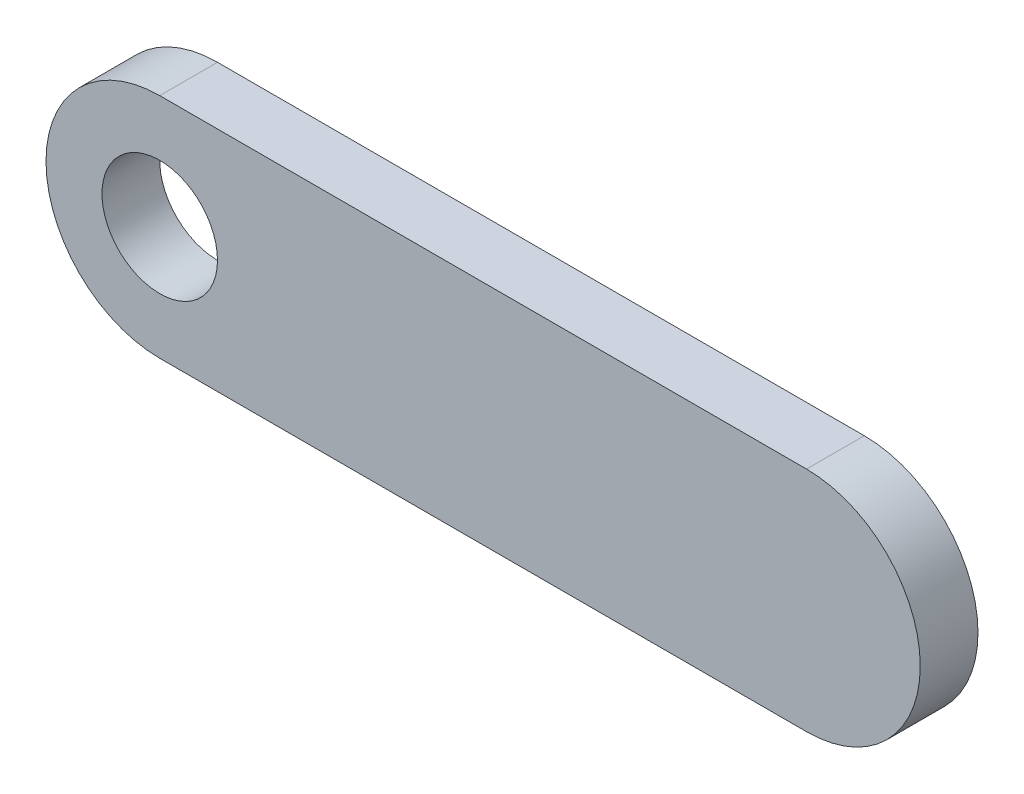
ISO-10303-21;
HEADER;
FILE_DESCRIPTION(('STEP AP214'),'2;1');
FILE_NAME('part.step','',(''),(''),'','','');
FILE_SCHEMA(('AUTOMOTIVE_DESIGN { 1 0 10303 214 1 1 1 1 }'));
ENDSEC;
DATA;
#1=APPLICATION_CONTEXT('core data for automotive mechanical design processes');
#2=APPLICATION_PROTOCOL_DEFINITION('international standard','automotive_design',2000,#1);
#3=PRODUCT_CONTEXT('',#1,'mechanical');
#4=PRODUCT('Part','Part','',(#3));
#5=PRODUCT_RELATED_PRODUCT_CATEGORY('part','',(#4));
#6=PRODUCT_DEFINITION_FORMATION('','',#4);
#7=PRODUCT_DEFINITION_CONTEXT('part definition',#1,'design');
#8=PRODUCT_DEFINITION('design','',#6,#7);
#9=PRODUCT_DEFINITION_SHAPE('','',#8);
#10=(LENGTH_UNIT() NAMED_UNIT(*) SI_UNIT(.MILLI.,.METRE.));
#11=(NAMED_UNIT(*) PLANE_ANGLE_UNIT() SI_UNIT($,.RADIAN.));
#12=(NAMED_UNIT(*) SI_UNIT($,.STERADIAN.) SOLID_ANGLE_UNIT());
#13=UNCERTAINTY_MEASURE_WITH_UNIT(LENGTH_MEASURE(1.E-05),#10,'distance_accuracy_value','');
#14=(GEOMETRIC_REPRESENTATION_CONTEXT(3) GLOBAL_UNCERTAINTY_ASSIGNED_CONTEXT((#13)) GLOBAL_UNIT_ASSIGNED_CONTEXT((#10,
#11,#12)) REPRESENTATION_CONTEXT('',''));
#15=CARTESIAN_POINT('',(0.,0.,0.));
#16=DIRECTION('',(0.,0.,1.));
#17=DIRECTION('',(1.,0.,0.));
#18=AXIS2_PLACEMENT_3D('',#15,#16,#17);
#19=CARTESIAN_POINT('',(0.,0.,25.));
#20=DIRECTION('',(0.,0.,1.));
#21=DIRECTION('',(1.,0.,0.));
#22=AXIS2_PLACEMENT_3D('',#19,#20,#21);
#23=PLANE('',#22);
#24=CARTESIAN_POINT('',(0.,0.,25.));
#25=DIRECTION('',(0.,0.,1.));
#26=DIRECTION('',(1.,0.,0.));
#27=AXIS2_PLACEMENT_3D('',#24,#25,#26);
#28=CIRCLE('',#27,49.2346828785804);
#29=CARTESIAN_POINT('',(0.,49.2346828785804,25.));
#30=VERTEX_POINT('',#29);
#31=CARTESIAN_POINT('',(0.,-49.2346828785804,25.));
#32=VERTEX_POINT('',#31);
#33=EDGE_CURVE('E87',#30,#32,#28,.T.);
#34=ORIENTED_EDGE('',*,*,#33,.T.);
#35=DIRECTION('',(1.,0.,0.));
#36=VECTOR('',#35,1.);
#37=CARTESIAN_POINT('',(0.,-49.2346828785804,25.));
#38=LINE('',#37,#36);
#39=CARTESIAN_POINT('',(280.,-49.2346828785804,25.));
#40=VERTEX_POINT('',#39);
#41=EDGE_CURVE('E82',#32,#40,#38,.T.);
#42=ORIENTED_EDGE('',*,*,#41,.T.);
#43=CARTESIAN_POINT('',(280.,0.,25.));
#44=DIRECTION('',(0.,0.,1.));
#45=DIRECTION('',(1.,0.,0.));
#46=AXIS2_PLACEMENT_3D('',#43,#44,#45);
#47=CIRCLE('',#46,49.2346828785804);
#48=CARTESIAN_POINT('',(280.,49.2346828785804,25.));
#49=VERTEX_POINT('',#48);
#50=EDGE_CURVE('E85',#40,#49,#47,.T.);
#51=ORIENTED_EDGE('',*,*,#50,.T.);
#52=DIRECTION('',(-1.,0.,0.));
#53=VECTOR('',#52,1.);
#54=CARTESIAN_POINT('',(0.,49.2346828785804,25.));
#55=LINE('',#54,#53);
#56=EDGE_CURVE('E52',#49,#30,#55,.T.);
#57=ORIENTED_EDGE('',*,*,#56,.T.);
#58=EDGE_LOOP('',(#34,#42,#51,#57));
#59=FACE_BOUND('',#58,.T.);
#60=CARTESIAN_POINT('',(0.,0.,25.));
#61=DIRECTION('',(0.,0.,1.));
#62=DIRECTION('',(1.,0.,0.));
#63=AXIS2_PLACEMENT_3D('',#60,#61,#62);
#64=CIRCLE('',#63,25.);
#65=CARTESIAN_POINT('',(25.,0.,25.));
#66=VERTEX_POINT('',#65);
#67=EDGE_CURVE('E102',#66,#66,#64,.T.);
#68=ORIENTED_EDGE('',*,*,#67,.F.);
#69=EDGE_LOOP('',(#68));
#70=FACE_BOUND('',#69,.T.);
#71=ADVANCED_FACE('F35',(#59,#70),#23,.T.);
#72=CARTESIAN_POINT('',(0.,0.,0.));
#73=DIRECTION('',(0.,0.,1.));
#74=DIRECTION('',(1.,0.,0.));
#75=AXIS2_PLACEMENT_3D('',#72,#73,#74);
#76=PLANE('',#75);
#77=CARTESIAN_POINT('',(0.,0.,0.));
#78=DIRECTION('',(0.,0.,1.));
#79=DIRECTION('',(1.,0.,0.));
#80=AXIS2_PLACEMENT_3D('',#77,#78,#79);
#81=CIRCLE('',#80,49.2346828785804);
#82=CARTESIAN_POINT('',(0.,49.2346828785804,0.));
#83=VERTEX_POINT('',#82);
#84=CARTESIAN_POINT('',(0.,-49.2346828785804,0.));
#85=VERTEX_POINT('',#84);
#86=EDGE_CURVE('E99',#83,#85,#81,.T.);
#87=ORIENTED_EDGE('',*,*,#86,.F.);
#88=DIRECTION('',(-1.,0.,0.));
#89=VECTOR('',#88,1.);
#90=CARTESIAN_POINT('',(0.,49.2346828785804,0.));
#91=LINE('',#90,#89);
#92=CARTESIAN_POINT('',(280.,49.2346828785804,0.));
#93=VERTEX_POINT('',#92);
#94=EDGE_CURVE('E75',#93,#83,#91,.T.);
#95=ORIENTED_EDGE('',*,*,#94,.F.);
#96=CARTESIAN_POINT('',(280.,0.,0.));
#97=DIRECTION('',(0.,0.,1.));
#98=DIRECTION('',(1.,0.,0.));
#99=AXIS2_PLACEMENT_3D('',#96,#97,#98);
#100=CIRCLE('',#99,49.2346828785804);
#101=CARTESIAN_POINT('',(280.,-49.2346828785804,0.));
#102=VERTEX_POINT('',#101);
#103=EDGE_CURVE('E69',#102,#93,#100,.T.);
#104=ORIENTED_EDGE('',*,*,#103,.F.);
#105=DIRECTION('',(1.,0.,0.));
#106=VECTOR('',#105,1.);
#107=CARTESIAN_POINT('',(0.,-49.2346828785804,0.));
#108=LINE('',#107,#106);
#109=EDGE_CURVE('E91',#85,#102,#108,.T.);
#110=ORIENTED_EDGE('',*,*,#109,.F.);
#111=EDGE_LOOP('',(#87,#95,#104,#110));
#112=FACE_BOUND('',#111,.T.);
#113=CARTESIAN_POINT('',(0.,0.,0.));
#114=DIRECTION('',(0.,0.,1.));
#115=DIRECTION('',(1.,0.,0.));
#116=AXIS2_PLACEMENT_3D('',#113,#114,#115);
#117=CIRCLE('',#116,25.);
#118=CARTESIAN_POINT('',(25.,0.,0.));
#119=VERTEX_POINT('',#118);
#120=EDGE_CURVE('E114',#119,#119,#117,.T.);
#121=ORIENTED_EDGE('',*,*,#120,.T.);
#122=EDGE_LOOP('',(#121));
#123=FACE_BOUND('',#122,.T.);
#124=ADVANCED_FACE('F110',(#112,#123),#76,.F.);
#125=CARTESIAN_POINT('',(0.,0.,25.));
#126=DIRECTION('',(0.,0.,-1.));
#127=DIRECTION('',(-1.,0.,0.));
#128=AXIS2_PLACEMENT_3D('',#125,#126,#127);
#129=CYLINDRICAL_SURFACE('',#128,49.2346828785804);
#130=ORIENTED_EDGE('',*,*,#86,.T.);
#131=DIRECTION('',(0.,0.,-1.));
#132=VECTOR('',#131,1.);
#133=CARTESIAN_POINT('',(0.,-49.2346828785804,25.));
#134=LINE('',#133,#132);
#135=EDGE_CURVE('E11',#32,#85,#134,.T.);
#136=ORIENTED_EDGE('',*,*,#135,.F.);
#137=ORIENTED_EDGE('',*,*,#33,.F.);
#138=DIRECTION('',(0.,0.,-1.));
#139=VECTOR('',#138,1.);
#140=CARTESIAN_POINT('',(0.,49.2346828785804,25.));
#141=LINE('',#140,#139);
#142=EDGE_CURVE('E95',#30,#83,#141,.T.);
#143=ORIENTED_EDGE('',*,*,#142,.T.);
#144=EDGE_LOOP('',(#130,#136,#137,#143));
#145=FACE_BOUND('',#144,.T.);
#146=ADVANCED_FACE('F37',(#145),#129,.T.);
#147=CARTESIAN_POINT('',(0.,-49.2346828785804,25.));
#148=DIRECTION('',(0.,1.,0.));
#149=DIRECTION('',(0.,0.,1.));
#150=AXIS2_PLACEMENT_3D('',#147,#148,#149);
#151=PLANE('',#150);
#152=ORIENTED_EDGE('',*,*,#109,.T.);
#153=DIRECTION('',(0.,0.,-1.));
#154=VECTOR('',#153,1.);
#155=CARTESIAN_POINT('',(280.,-49.2346828785804,25.));
#156=LINE('',#155,#154);
#157=EDGE_CURVE('E44',#40,#102,#156,.T.);
#158=ORIENTED_EDGE('',*,*,#157,.F.);
#159=ORIENTED_EDGE('',*,*,#41,.F.);
#160=ORIENTED_EDGE('',*,*,#135,.T.);
#161=EDGE_LOOP('',(#152,#158,#159,#160));
#162=FACE_BOUND('',#161,.T.);
#163=ADVANCED_FACE('F90',(#162),#151,.F.);
#164=CARTESIAN_POINT('',(280.,0.,25.));
#165=DIRECTION('',(0.,0.,-1.));
#166=DIRECTION('',(-1.,0.,0.));
#167=AXIS2_PLACEMENT_3D('',#164,#165,#166);
#168=CYLINDRICAL_SURFACE('',#167,49.2346828785804);
#169=ORIENTED_EDGE('',*,*,#103,.T.);
#170=DIRECTION('',(0.,0.,-1.));
#171=VECTOR('',#170,1.);
#172=CARTESIAN_POINT('',(280.,49.2346828785804,25.));
#173=LINE('',#172,#171);
#174=EDGE_CURVE('E92',#49,#93,#173,.T.);
#175=ORIENTED_EDGE('',*,*,#174,.F.);
#176=ORIENTED_EDGE('',*,*,#50,.F.);
#177=ORIENTED_EDGE('',*,*,#157,.T.);
#178=EDGE_LOOP('',(#169,#175,#176,#177));
#179=FACE_BOUND('',#178,.T.);
#180=ADVANCED_FACE('F93',(#179),#168,.T.);
#181=CARTESIAN_POINT('',(0.,49.2346828785804,25.));
#182=DIRECTION('',(0.,-1.,0.));
#183=DIRECTION('',(0.,0.,-1.));
#184=AXIS2_PLACEMENT_3D('',#181,#182,#183);
#185=PLANE('',#184);
#186=ORIENTED_EDGE('',*,*,#94,.T.);
#187=ORIENTED_EDGE('',*,*,#142,.F.);
#188=ORIENTED_EDGE('',*,*,#56,.F.);
#189=ORIENTED_EDGE('',*,*,#174,.T.);
#190=EDGE_LOOP('',(#186,#187,#188,#189));
#191=FACE_BOUND('',#190,.T.);
#192=ADVANCED_FACE('F107',(#191),#185,.F.);
#193=CARTESIAN_POINT('',(0.,0.,25.));
#194=DIRECTION('',(0.,0.,-1.));
#195=DIRECTION('',(-1.,0.,0.));
#196=AXIS2_PLACEMENT_3D('',#193,#194,#195);
#197=CYLINDRICAL_SURFACE('',#196,25.);
#198=ORIENTED_EDGE('',*,*,#67,.T.);
#199=EDGE_LOOP('',(#198));
#200=FACE_BOUND('',#199,.T.);
#201=ORIENTED_EDGE('',*,*,#120,.F.);
#202=EDGE_LOOP('',(#201));
#203=FACE_BOUND('',#202,.T.);
#204=ADVANCED_FACE('F120',(#200,#203),#197,.F.);
#205=CLOSED_SHELL('',(#71,#124,#146,#163,#180,#192,#204));
#206=MANIFOLD_SOLID_BREP('B2',#205);
#207=ADVANCED_BREP_SHAPE_REPRESENTATION('',(#18,#206),#14);
#208=SHAPE_DEFINITION_REPRESENTATION(#9,#207);
ENDSEC;
END-ISO-10303-21;
